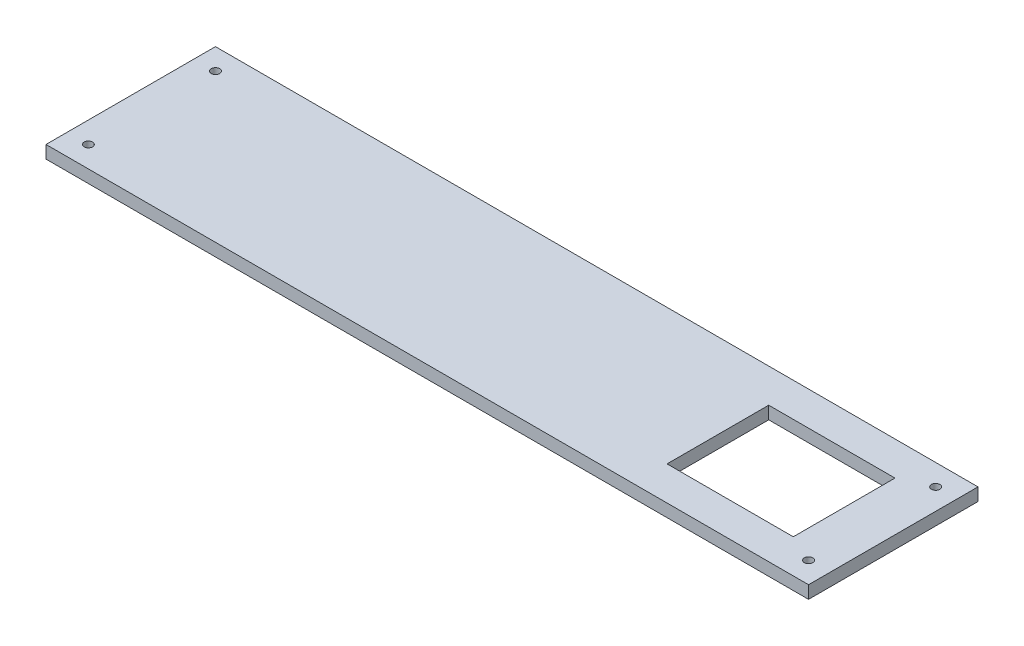
ISO-10303-21;
HEADER;
FILE_DESCRIPTION(('STEP AP214'),'2;1');
FILE_NAME('part.step','',(''),(''),'','','');
FILE_SCHEMA(('AUTOMOTIVE_DESIGN { 1 0 10303 214 1 1 1 1 }'));
ENDSEC;
DATA;
#1=APPLICATION_CONTEXT('core data for automotive mechanical design processes');
#2=APPLICATION_PROTOCOL_DEFINITION('international standard','automotive_design',2000,#1);
#3=PRODUCT_CONTEXT('',#1,'mechanical');
#4=PRODUCT('Part','Part','',(#3));
#5=PRODUCT_RELATED_PRODUCT_CATEGORY('part','',(#4));
#6=PRODUCT_DEFINITION_FORMATION('','',#4);
#7=PRODUCT_DEFINITION_CONTEXT('part definition',#1,'design');
#8=PRODUCT_DEFINITION('design','',#6,#7);
#9=PRODUCT_DEFINITION_SHAPE('','',#8);
#10=(LENGTH_UNIT() NAMED_UNIT(*) SI_UNIT(.MILLI.,.METRE.));
#11=(NAMED_UNIT(*) PLANE_ANGLE_UNIT() SI_UNIT($,.RADIAN.));
#12=(NAMED_UNIT(*) SI_UNIT($,.STERADIAN.) SOLID_ANGLE_UNIT());
#13=UNCERTAINTY_MEASURE_WITH_UNIT(LENGTH_MEASURE(1.E-05),#10,'distance_accuracy_value','');
#14=(GEOMETRIC_REPRESENTATION_CONTEXT(3) GLOBAL_UNCERTAINTY_ASSIGNED_CONTEXT((#13)) GLOBAL_UNIT_ASSIGNED_CONTEXT((#10,
#11,#12)) REPRESENTATION_CONTEXT('',''));
#15=CARTESIAN_POINT('',(0.,0.,0.));
#16=DIRECTION('',(0.,0.,1.));
#17=DIRECTION('',(1.,0.,0.));
#18=AXIS2_PLACEMENT_3D('',#15,#16,#17);
#19=CARTESIAN_POINT('',(0.,15.,0.));
#20=DIRECTION('',(0.,-1.,0.));
#21=DIRECTION('',(0.,0.,-1.));
#22=AXIS2_PLACEMENT_3D('',#19,#20,#21);
#23=PLANE('',#22);
#24=CARTESIAN_POINT('',(-425.,15.,75.));
#25=DIRECTION('',(0.,1.,0.));
#26=DIRECTION('',(0.,0.,-1.));
#27=AXIS2_PLACEMENT_3D('',#24,#25,#26);
#28=CIRCLE('',#27,4.99999999999999);
#29=CARTESIAN_POINT('',(-425.,15.,70.));
#30=VERTEX_POINT('',#29);
#31=EDGE_CURVE('E248',#30,#30,#28,.T.);
#32=ORIENTED_EDGE('',*,*,#31,.F.);
#33=EDGE_LOOP('',(#32));
#34=FACE_BOUND('',#33,.T.);
#35=CARTESIAN_POINT('',(425.,15.,-75.));
#36=DIRECTION('',(0.,1.,0.));
#37=DIRECTION('',(0.,0.,-1.));
#38=AXIS2_PLACEMENT_3D('',#35,#36,#37);
#39=CIRCLE('',#38,4.99999999999999);
#40=CARTESIAN_POINT('',(425.,15.,-80.));
#41=VERTEX_POINT('',#40);
#42=EDGE_CURVE('E255',#41,#41,#39,.T.);
#43=ORIENTED_EDGE('',*,*,#42,.F.);
#44=EDGE_LOOP('',(#43));
#45=FACE_BOUND('',#44,.T.);
#46=CARTESIAN_POINT('',(425.,15.,75.));
#47=DIRECTION('',(0.,1.,0.));
#48=DIRECTION('',(0.,0.,1.));
#49=AXIS2_PLACEMENT_3D('',#46,#47,#48);
#50=CIRCLE('',#49,4.99999999999999);
#51=CARTESIAN_POINT('',(425.,15.,80.));
#52=VERTEX_POINT('',#51);
#53=EDGE_CURVE('E239',#52,#52,#50,.T.);
#54=ORIENTED_EDGE('',*,*,#53,.F.);
#55=EDGE_LOOP('',(#54));
#56=FACE_BOUND('',#55,.T.);
#57=CARTESIAN_POINT('',(-425.,15.,-75.));
#58=DIRECTION('',(0.,1.,0.));
#59=DIRECTION('',(0.,0.,1.));
#60=AXIS2_PLACEMENT_3D('',#57,#58,#59);
#61=CIRCLE('',#60,4.99999999999999);
#62=CARTESIAN_POINT('',(-425.,15.,-70.));
#63=VERTEX_POINT('',#62);
#64=EDGE_CURVE('E128',#63,#63,#61,.T.);
#65=ORIENTED_EDGE('',*,*,#64,.F.);
#66=EDGE_LOOP('',(#65));
#67=FACE_BOUND('',#66,.T.);
#68=DIRECTION('',(0.,0.,-1.));
#69=VECTOR('',#68,1.);
#70=CARTESIAN_POINT('',(450.,15.,100.));
#71=LINE('',#70,#69);
#72=CARTESIAN_POINT('',(450.,15.,100.));
#73=VERTEX_POINT('',#72);
#74=CARTESIAN_POINT('',(450.,15.,-100.));
#75=VERTEX_POINT('',#74);
#76=EDGE_CURVE('E138',#73,#75,#71,.T.);
#77=ORIENTED_EDGE('',*,*,#76,.T.);
#78=DIRECTION('',(-1.,0.,0.));
#79=VECTOR('',#78,1.);
#80=CARTESIAN_POINT('',(-450.,15.,-100.));
#81=LINE('',#80,#79);
#82=CARTESIAN_POINT('',(-450.,15.,-100.));
#83=VERTEX_POINT('',#82);
#84=EDGE_CURVE('E141',#75,#83,#81,.T.);
#85=ORIENTED_EDGE('',*,*,#84,.T.);
#86=DIRECTION('',(0.,0.,1.));
#87=VECTOR('',#86,1.);
#88=CARTESIAN_POINT('',(-450.,15.,100.));
#89=LINE('',#88,#87);
#90=CARTESIAN_POINT('',(-450.,15.,100.));
#91=VERTEX_POINT('',#90);
#92=EDGE_CURVE('E144',#83,#91,#89,.T.);
#93=ORIENTED_EDGE('',*,*,#92,.T.);
#94=DIRECTION('',(1.,0.,0.));
#95=VECTOR('',#94,1.);
#96=CARTESIAN_POINT('',(-450.,15.,100.));
#97=LINE('',#96,#95);
#98=EDGE_CURVE('E146',#91,#73,#97,.T.);
#99=ORIENTED_EDGE('',*,*,#98,.T.);
#100=EDGE_LOOP('',(#77,#85,#93,#99));
#101=FACE_BOUND('',#100,.T.);
#102=DIRECTION('',(0.,0.,-1.));
#103=VECTOR('',#102,1.);
#104=CARTESIAN_POINT('',(392.,15.,60.));
#105=LINE('',#104,#103);
#106=CARTESIAN_POINT('',(392.,15.,60.));
#107=VERTEX_POINT('',#106);
#108=CARTESIAN_POINT('',(392.,15.,-60.));
#109=VERTEX_POINT('',#108);
#110=EDGE_CURVE('E100',#107,#109,#105,.T.);
#111=ORIENTED_EDGE('',*,*,#110,.F.);
#112=DIRECTION('',(1.,0.,0.));
#113=VECTOR('',#112,1.);
#114=CARTESIAN_POINT('',(243.,15.,60.));
#115=LINE('',#114,#113);
#116=CARTESIAN_POINT('',(243.,15.,60.));
#117=VERTEX_POINT('',#116);
#118=EDGE_CURVE('E122',#117,#107,#115,.T.);
#119=ORIENTED_EDGE('',*,*,#118,.F.);
#120=DIRECTION('',(0.,0.,1.));
#121=VECTOR('',#120,1.);
#122=CARTESIAN_POINT('',(243.,15.,60.));
#123=LINE('',#122,#121);
#124=CARTESIAN_POINT('',(243.,15.,-60.));
#125=VERTEX_POINT('',#124);
#126=EDGE_CURVE('E120',#125,#117,#123,.T.);
#127=ORIENTED_EDGE('',*,*,#126,.F.);
#128=DIRECTION('',(-1.,0.,0.));
#129=VECTOR('',#128,1.);
#130=CARTESIAN_POINT('',(243.,15.,-60.));
#131=LINE('',#130,#129);
#132=EDGE_CURVE('E108',#109,#125,#131,.T.);
#133=ORIENTED_EDGE('',*,*,#132,.F.);
#134=EDGE_LOOP('',(#111,#119,#127,#133));
#135=FACE_BOUND('',#134,.T.);
#136=ADVANCED_FACE('F35',(#34,#45,#56,#67,#101,#135),#23,.F.);
#137=CARTESIAN_POINT('',(0.,0.,0.));
#138=DIRECTION('',(0.,-1.,0.));
#139=DIRECTION('',(0.,0.,-1.));
#140=AXIS2_PLACEMENT_3D('',#137,#138,#139);
#141=PLANE('',#140);
#142=CARTESIAN_POINT('',(-425.,0.,75.));
#143=DIRECTION('',(0.,1.,0.));
#144=DIRECTION('',(0.,0.,-1.));
#145=AXIS2_PLACEMENT_3D('',#142,#143,#144);
#146=CIRCLE('',#145,4.99999999999999);
#147=CARTESIAN_POINT('',(-425.,0.,70.));
#148=VERTEX_POINT('',#147);
#149=EDGE_CURVE('E252',#148,#148,#146,.T.);
#150=ORIENTED_EDGE('',*,*,#149,.T.);
#151=EDGE_LOOP('',(#150));
#152=FACE_BOUND('',#151,.T.);
#153=CARTESIAN_POINT('',(425.,0.,-75.));
#154=DIRECTION('',(0.,1.,0.));
#155=DIRECTION('',(0.,0.,-1.));
#156=AXIS2_PLACEMENT_3D('',#153,#154,#155);
#157=CIRCLE('',#156,4.99999999999999);
#158=CARTESIAN_POINT('',(425.,0.,-80.));
#159=VERTEX_POINT('',#158);
#160=EDGE_CURVE('E245',#159,#159,#157,.T.);
#161=ORIENTED_EDGE('',*,*,#160,.T.);
#162=EDGE_LOOP('',(#161));
#163=FACE_BOUND('',#162,.T.);
#164=CARTESIAN_POINT('',(425.,0.,75.));
#165=DIRECTION('',(0.,1.,0.));
#166=DIRECTION('',(0.,0.,1.));
#167=AXIS2_PLACEMENT_3D('',#164,#165,#166);
#168=CIRCLE('',#167,4.99999999999999);
#169=CARTESIAN_POINT('',(425.,0.,80.));
#170=VERTEX_POINT('',#169);
#171=EDGE_CURVE('E242',#170,#170,#168,.T.);
#172=ORIENTED_EDGE('',*,*,#171,.T.);
#173=EDGE_LOOP('',(#172));
#174=FACE_BOUND('',#173,.T.);
#175=CARTESIAN_POINT('',(-425.,0.,-75.));
#176=DIRECTION('',(0.,1.,0.));
#177=DIRECTION('',(0.,0.,1.));
#178=AXIS2_PLACEMENT_3D('',#175,#176,#177);
#179=CIRCLE('',#178,4.99999999999999);
#180=CARTESIAN_POINT('',(-425.,0.,-70.));
#181=VERTEX_POINT('',#180);
#182=EDGE_CURVE('E251',#181,#181,#179,.T.);
#183=ORIENTED_EDGE('',*,*,#182,.T.);
#184=EDGE_LOOP('',(#183));
#185=FACE_BOUND('',#184,.T.);
#186=DIRECTION('',(0.,0.,-1.));
#187=VECTOR('',#186,1.);
#188=CARTESIAN_POINT('',(450.,0.,100.));
#189=LINE('',#188,#187);
#190=CARTESIAN_POINT('',(450.,0.,100.));
#191=VERTEX_POINT('',#190);
#192=CARTESIAN_POINT('',(450.,0.,-100.));
#193=VERTEX_POINT('',#192);
#194=EDGE_CURVE('E116',#191,#193,#189,.T.);
#195=ORIENTED_EDGE('',*,*,#194,.F.);
#196=DIRECTION('',(1.,0.,0.));
#197=VECTOR('',#196,1.);
#198=CARTESIAN_POINT('',(-450.,0.,100.));
#199=LINE('',#198,#197);
#200=CARTESIAN_POINT('',(-450.,0.,100.));
#201=VERTEX_POINT('',#200);
#202=EDGE_CURVE('E142',#201,#191,#199,.T.);
#203=ORIENTED_EDGE('',*,*,#202,.F.);
#204=DIRECTION('',(0.,0.,1.));
#205=VECTOR('',#204,1.);
#206=CARTESIAN_POINT('',(-450.,0.,100.));
#207=LINE('',#206,#205);
#208=CARTESIAN_POINT('',(-450.,0.,-100.));
#209=VERTEX_POINT('',#208);
#210=EDGE_CURVE('E153',#209,#201,#207,.T.);
#211=ORIENTED_EDGE('',*,*,#210,.F.);
#212=DIRECTION('',(-1.,0.,0.));
#213=VECTOR('',#212,1.);
#214=CARTESIAN_POINT('',(-450.,0.,-100.));
#215=LINE('',#214,#213);
#216=EDGE_CURVE('E151',#193,#209,#215,.T.);
#217=ORIENTED_EDGE('',*,*,#216,.F.);
#218=EDGE_LOOP('',(#195,#203,#211,#217));
#219=FACE_BOUND('',#218,.T.);
#220=DIRECTION('',(1.,0.,0.));
#221=VECTOR('',#220,1.);
#222=CARTESIAN_POINT('',(243.,0.,60.));
#223=LINE('',#222,#221);
#224=CARTESIAN_POINT('',(243.,0.,60.));
#225=VERTEX_POINT('',#224);
#226=CARTESIAN_POINT('',(392.,0.,60.));
#227=VERTEX_POINT('',#226);
#228=EDGE_CURVE('E109',#225,#227,#223,.T.);
#229=ORIENTED_EDGE('',*,*,#228,.T.);
#230=DIRECTION('',(0.,0.,-1.));
#231=VECTOR('',#230,1.);
#232=CARTESIAN_POINT('',(392.,0.,60.));
#233=LINE('',#232,#231);
#234=CARTESIAN_POINT('',(392.,0.,-60.));
#235=VERTEX_POINT('',#234);
#236=EDGE_CURVE('E58',#227,#235,#233,.T.);
#237=ORIENTED_EDGE('',*,*,#236,.T.);
#238=DIRECTION('',(-1.,0.,0.));
#239=VECTOR('',#238,1.);
#240=CARTESIAN_POINT('',(243.,0.,-60.));
#241=LINE('',#240,#239);
#242=CARTESIAN_POINT('',(243.,0.,-60.));
#243=VERTEX_POINT('',#242);
#244=EDGE_CURVE('E115',#235,#243,#241,.T.);
#245=ORIENTED_EDGE('',*,*,#244,.T.);
#246=DIRECTION('',(0.,0.,1.));
#247=VECTOR('',#246,1.);
#248=CARTESIAN_POINT('',(243.,0.,60.));
#249=LINE('',#248,#247);
#250=EDGE_CURVE('E130',#243,#225,#249,.T.);
#251=ORIENTED_EDGE('',*,*,#250,.T.);
#252=EDGE_LOOP('',(#229,#237,#245,#251));
#253=FACE_BOUND('',#252,.T.);
#254=ADVANCED_FACE('F171',(#152,#163,#174,#185,#219,#253),#141,.T.);
#255=CARTESIAN_POINT('',(450.,15.,100.));
#256=DIRECTION('',(-1.,0.,0.));
#257=DIRECTION('',(0.,0.,1.));
#258=AXIS2_PLACEMENT_3D('',#255,#256,#257);
#259=PLANE('',#258);
#260=ORIENTED_EDGE('',*,*,#194,.T.);
#261=DIRECTION('',(0.,-1.,0.));
#262=VECTOR('',#261,1.);
#263=CARTESIAN_POINT('',(450.,15.,-100.));
#264=LINE('',#263,#262);
#265=EDGE_CURVE('E11',#75,#193,#264,.T.);
#266=ORIENTED_EDGE('',*,*,#265,.F.);
#267=ORIENTED_EDGE('',*,*,#76,.F.);
#268=DIRECTION('',(0.,-1.,0.));
#269=VECTOR('',#268,1.);
#270=CARTESIAN_POINT('',(450.,15.,100.));
#271=LINE('',#270,#269);
#272=EDGE_CURVE('E148',#73,#191,#271,.T.);
#273=ORIENTED_EDGE('',*,*,#272,.T.);
#274=EDGE_LOOP('',(#260,#266,#267,#273));
#275=FACE_BOUND('',#274,.T.);
#276=ADVANCED_FACE('F37',(#275),#259,.F.);
#277=CARTESIAN_POINT('',(-450.,15.,-100.));
#278=DIRECTION('',(0.,0.,1.));
#279=DIRECTION('',(1.,0.,0.));
#280=AXIS2_PLACEMENT_3D('',#277,#278,#279);
#281=PLANE('',#280);
#282=ORIENTED_EDGE('',*,*,#216,.T.);
#283=DIRECTION('',(0.,-1.,0.));
#284=VECTOR('',#283,1.);
#285=CARTESIAN_POINT('',(-450.,15.,-100.));
#286=LINE('',#285,#284);
#287=EDGE_CURVE('E43',#83,#209,#286,.T.);
#288=ORIENTED_EDGE('',*,*,#287,.F.);
#289=ORIENTED_EDGE('',*,*,#84,.F.);
#290=ORIENTED_EDGE('',*,*,#265,.T.);
#291=EDGE_LOOP('',(#282,#288,#289,#290));
#292=FACE_BOUND('',#291,.T.);
#293=ADVANCED_FACE('F181',(#292),#281,.F.);
#294=CARTESIAN_POINT('',(-450.,15.,100.));
#295=DIRECTION('',(1.,0.,0.));
#296=DIRECTION('',(0.,0.,-1.));
#297=AXIS2_PLACEMENT_3D('',#294,#295,#296);
#298=PLANE('',#297);
#299=ORIENTED_EDGE('',*,*,#210,.T.);
#300=DIRECTION('',(0.,-1.,0.));
#301=VECTOR('',#300,1.);
#302=CARTESIAN_POINT('',(-450.,15.,100.));
#303=LINE('',#302,#301);
#304=EDGE_CURVE('E158',#91,#201,#303,.T.);
#305=ORIENTED_EDGE('',*,*,#304,.F.);
#306=ORIENTED_EDGE('',*,*,#92,.F.);
#307=ORIENTED_EDGE('',*,*,#287,.T.);
#308=EDGE_LOOP('',(#299,#305,#306,#307));
#309=FACE_BOUND('',#308,.T.);
#310=ADVANCED_FACE('F165',(#309),#298,.F.);
#311=CARTESIAN_POINT('',(-450.,15.,100.));
#312=DIRECTION('',(0.,0.,-1.));
#313=DIRECTION('',(-1.,0.,0.));
#314=AXIS2_PLACEMENT_3D('',#311,#312,#313);
#315=PLANE('',#314);
#316=ORIENTED_EDGE('',*,*,#202,.T.);
#317=ORIENTED_EDGE('',*,*,#272,.F.);
#318=ORIENTED_EDGE('',*,*,#98,.F.);
#319=ORIENTED_EDGE('',*,*,#304,.T.);
#320=EDGE_LOOP('',(#316,#317,#318,#319));
#321=FACE_BOUND('',#320,.T.);
#322=ADVANCED_FACE('F175',(#321),#315,.F.);
#323=CARTESIAN_POINT('',(392.,15.,60.));
#324=DIRECTION('',(-1.,0.,0.));
#325=DIRECTION('',(0.,0.,1.));
#326=AXIS2_PLACEMENT_3D('',#323,#324,#325);
#327=PLANE('',#326);
#328=ORIENTED_EDGE('',*,*,#236,.F.);
#329=DIRECTION('',(0.,-1.,0.));
#330=VECTOR('',#329,1.);
#331=CARTESIAN_POINT('',(392.,15.,60.));
#332=LINE('',#331,#330);
#333=EDGE_CURVE('E104',#107,#227,#332,.T.);
#334=ORIENTED_EDGE('',*,*,#333,.F.);
#335=ORIENTED_EDGE('',*,*,#110,.T.);
#336=DIRECTION('',(0.,-1.,0.));
#337=VECTOR('',#336,1.);
#338=CARTESIAN_POINT('',(392.,15.,-60.));
#339=LINE('',#338,#337);
#340=EDGE_CURVE('E103',#109,#235,#339,.T.);
#341=ORIENTED_EDGE('',*,*,#340,.T.);
#342=EDGE_LOOP('',(#328,#334,#335,#341));
#343=FACE_BOUND('',#342,.T.);
#344=ADVANCED_FACE('F102',(#343),#327,.T.);
#345=CARTESIAN_POINT('',(243.,15.,-60.));
#346=DIRECTION('',(0.,0.,1.));
#347=DIRECTION('',(1.,0.,0.));
#348=AXIS2_PLACEMENT_3D('',#345,#346,#347);
#349=PLANE('',#348);
#350=ORIENTED_EDGE('',*,*,#244,.F.);
#351=ORIENTED_EDGE('',*,*,#340,.F.);
#352=ORIENTED_EDGE('',*,*,#132,.T.);
#353=DIRECTION('',(0.,-1.,0.));
#354=VECTOR('',#353,1.);
#355=CARTESIAN_POINT('',(243.,15.,-60.));
#356=LINE('',#355,#354);
#357=EDGE_CURVE('E117',#125,#243,#356,.T.);
#358=ORIENTED_EDGE('',*,*,#357,.T.);
#359=EDGE_LOOP('',(#350,#351,#352,#358));
#360=FACE_BOUND('',#359,.T.);
#361=ADVANCED_FACE('F112',(#360),#349,.T.);
#362=CARTESIAN_POINT('',(243.,15.,60.));
#363=DIRECTION('',(1.,0.,0.));
#364=DIRECTION('',(0.,0.,-1.));
#365=AXIS2_PLACEMENT_3D('',#362,#363,#364);
#366=PLANE('',#365);
#367=ORIENTED_EDGE('',*,*,#250,.F.);
#368=ORIENTED_EDGE('',*,*,#357,.F.);
#369=ORIENTED_EDGE('',*,*,#126,.T.);
#370=DIRECTION('',(0.,-1.,0.));
#371=VECTOR('',#370,1.);
#372=CARTESIAN_POINT('',(243.,15.,60.));
#373=LINE('',#372,#371);
#374=EDGE_CURVE('E50',#117,#225,#373,.T.);
#375=ORIENTED_EDGE('',*,*,#374,.T.);
#376=EDGE_LOOP('',(#367,#368,#369,#375));
#377=FACE_BOUND('',#376,.T.);
#378=ADVANCED_FACE('F209',(#377),#366,.T.);
#379=CARTESIAN_POINT('',(243.,15.,60.));
#380=DIRECTION('',(0.,0.,-1.));
#381=DIRECTION('',(-1.,0.,0.));
#382=AXIS2_PLACEMENT_3D('',#379,#380,#381);
#383=PLANE('',#382);
#384=ORIENTED_EDGE('',*,*,#228,.F.);
#385=ORIENTED_EDGE('',*,*,#374,.F.);
#386=ORIENTED_EDGE('',*,*,#118,.T.);
#387=ORIENTED_EDGE('',*,*,#333,.T.);
#388=EDGE_LOOP('',(#384,#385,#386,#387));
#389=FACE_BOUND('',#388,.T.);
#390=ADVANCED_FACE('F213',(#389),#383,.T.);
#391=CARTESIAN_POINT('',(-425.,15.,-75.));
#392=DIRECTION('',(0.,-1.,0.));
#393=DIRECTION('',(0.,0.,-1.));
#394=AXIS2_PLACEMENT_3D('',#391,#392,#393);
#395=CYLINDRICAL_SURFACE('',#394,4.99999999999999);
#396=ORIENTED_EDGE('',*,*,#64,.T.);
#397=EDGE_LOOP('',(#396));
#398=FACE_BOUND('',#397,.T.);
#399=ORIENTED_EDGE('',*,*,#182,.F.);
#400=EDGE_LOOP('',(#399));
#401=FACE_BOUND('',#400,.T.);
#402=ADVANCED_FACE('F219',(#398,#401),#395,.F.);
#403=CARTESIAN_POINT('',(425.,15.,75.));
#404=DIRECTION('',(0.,-1.,0.));
#405=DIRECTION('',(0.,0.,-1.));
#406=AXIS2_PLACEMENT_3D('',#403,#404,#405);
#407=CYLINDRICAL_SURFACE('',#406,4.99999999999999);
#408=ORIENTED_EDGE('',*,*,#53,.T.);
#409=EDGE_LOOP('',(#408));
#410=FACE_BOUND('',#409,.T.);
#411=ORIENTED_EDGE('',*,*,#171,.F.);
#412=EDGE_LOOP('',(#411));
#413=FACE_BOUND('',#412,.T.);
#414=ADVANCED_FACE('F222',(#410,#413),#407,.F.);
#415=CARTESIAN_POINT('',(425.,15.,-75.));
#416=DIRECTION('',(0.,-1.,0.));
#417=DIRECTION('',(0.,0.,-1.));
#418=AXIS2_PLACEMENT_3D('',#415,#416,#417);
#419=CYLINDRICAL_SURFACE('',#418,4.99999999999999);
#420=ORIENTED_EDGE('',*,*,#42,.T.);
#421=EDGE_LOOP('',(#420));
#422=FACE_BOUND('',#421,.T.);
#423=ORIENTED_EDGE('',*,*,#160,.F.);
#424=EDGE_LOOP('',(#423));
#425=FACE_BOUND('',#424,.T.);
#426=ADVANCED_FACE('F224',(#422,#425),#419,.F.);
#427=CARTESIAN_POINT('',(-425.,15.,75.));
#428=DIRECTION('',(0.,-1.,0.));
#429=DIRECTION('',(0.,0.,-1.));
#430=AXIS2_PLACEMENT_3D('',#427,#428,#429);
#431=CYLINDRICAL_SURFACE('',#430,4.99999999999999);
#432=ORIENTED_EDGE('',*,*,#31,.T.);
#433=EDGE_LOOP('',(#432));
#434=FACE_BOUND('',#433,.T.);
#435=ORIENTED_EDGE('',*,*,#149,.F.);
#436=EDGE_LOOP('',(#435));
#437=FACE_BOUND('',#436,.T.);
#438=ADVANCED_FACE('F227',(#434,#437),#431,.F.);
#439=CLOSED_SHELL('',(#136,#254,#276,#293,#310,#322,#344,#361,#378,#390,#402,#414,#426,#438));
#440=MANIFOLD_SOLID_BREP('B2',#439);
#441=ADVANCED_BREP_SHAPE_REPRESENTATION('',(#18,#440),#14);
#442=SHAPE_DEFINITION_REPRESENTATION(#9,#441);
ENDSEC;
END-ISO-10303-21;
